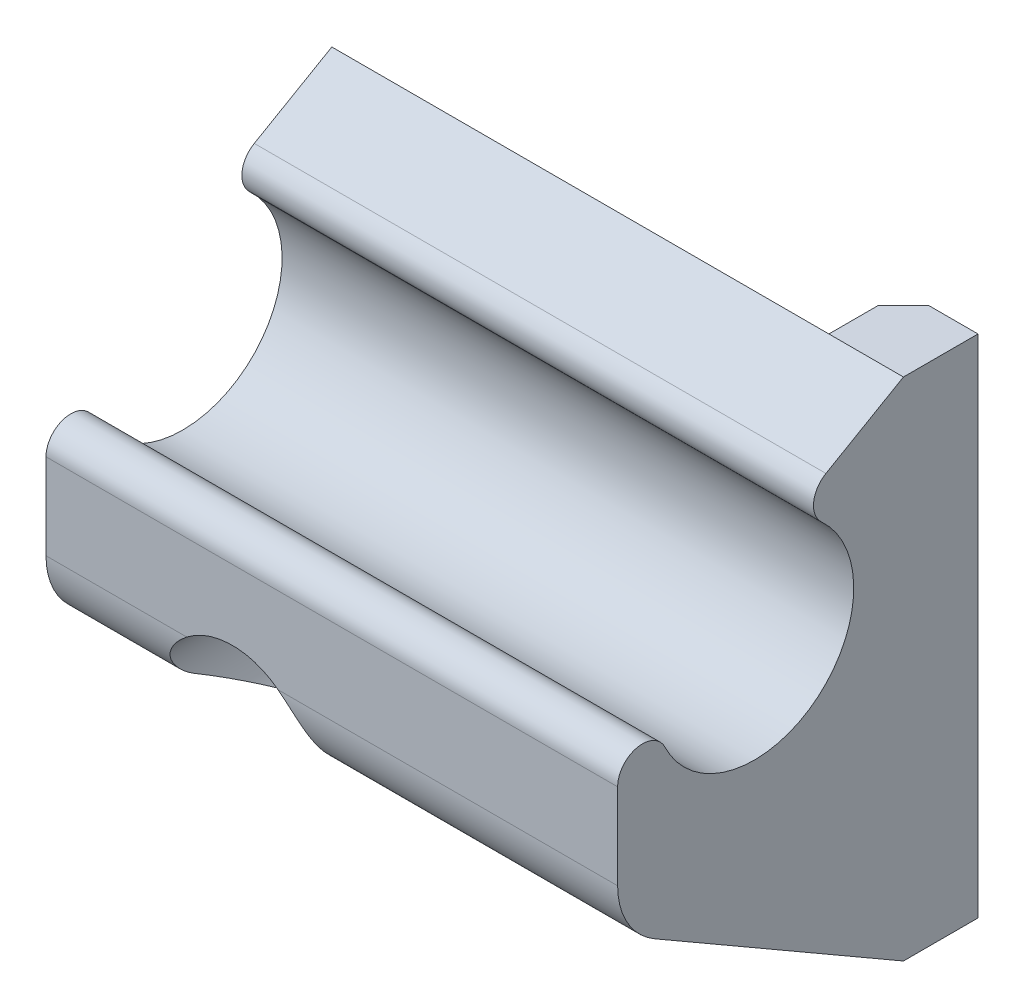
ISO-10303-21;
HEADER;
FILE_DESCRIPTION(('STEP AP214'),'2;1');
FILE_NAME('part.step','',(''),(''),'','','');
FILE_SCHEMA(('AUTOMOTIVE_DESIGN { 1 0 10303 214 1 1 1 1 }'));
ENDSEC;
DATA;
#1=APPLICATION_CONTEXT('core data for automotive mechanical design processes');
#2=APPLICATION_PROTOCOL_DEFINITION('international standard','automotive_design',2000,#1);
#3=PRODUCT_CONTEXT('',#1,'mechanical');
#4=PRODUCT('Part','Part','',(#3));
#5=PRODUCT_RELATED_PRODUCT_CATEGORY('part','',(#4));
#6=PRODUCT_DEFINITION_FORMATION('','',#4);
#7=PRODUCT_DEFINITION_CONTEXT('part definition',#1,'design');
#8=PRODUCT_DEFINITION('design','',#6,#7);
#9=PRODUCT_DEFINITION_SHAPE('','',#8);
#10=(LENGTH_UNIT() NAMED_UNIT(*) SI_UNIT(.MILLI.,.METRE.));
#11=(NAMED_UNIT(*) PLANE_ANGLE_UNIT() SI_UNIT($,.RADIAN.));
#12=(NAMED_UNIT(*) SI_UNIT($,.STERADIAN.) SOLID_ANGLE_UNIT());
#13=UNCERTAINTY_MEASURE_WITH_UNIT(LENGTH_MEASURE(1.E-05),#10,'distance_accuracy_value','');
#14=(GEOMETRIC_REPRESENTATION_CONTEXT(3) GLOBAL_UNCERTAINTY_ASSIGNED_CONTEXT((#13)) GLOBAL_UNIT_ASSIGNED_CONTEXT((#10,
#11,#12)) REPRESENTATION_CONTEXT('',''));
#15=CARTESIAN_POINT('',(0.,0.,0.));
#16=DIRECTION('',(0.,0.,1.));
#17=DIRECTION('',(1.,0.,0.));
#18=AXIS2_PLACEMENT_3D('',#15,#16,#17);
#19=CARTESIAN_POINT('',(0.,0.,0.));
#20=DIRECTION('',(0.,0.,1.));
#21=DIRECTION('',(1.,0.,0.));
#22=AXIS2_PLACEMENT_3D('',#19,#20,#21);
#23=CYLINDRICAL_SURFACE('',#22,1.6);
#24=CARTESIAN_POINT('',(0.,0.,0.));
#25=DIRECTION('',(0.,0.,1.));
#26=DIRECTION('',(1.,0.,0.));
#27=AXIS2_PLACEMENT_3D('',#24,#25,#26);
#28=CIRCLE('',#27,1.6);
#29=CARTESIAN_POINT('',(1.6,0.,0.));
#30=VERTEX_POINT('',#29);
#31=EDGE_CURVE('E193',#30,#30,#28,.T.);
#32=ORIENTED_EDGE('',*,*,#31,.F.);
#33=EDGE_LOOP('',(#32));
#34=FACE_BOUND('',#33,.T.);
#35=CARTESIAN_POINT('',(0.,0.,5.5));
#36=DIRECTION('',(0.,0.,1.));
#37=DIRECTION('',(1.,0.,0.));
#38=AXIS2_PLACEMENT_3D('',#35,#36,#37);
#39=CIRCLE('',#38,1.6);
#40=CARTESIAN_POINT('',(1.6,0.,5.5));
#41=VERTEX_POINT('',#40);
#42=EDGE_CURVE('E183',#41,#41,#39,.F.);
#43=ORIENTED_EDGE('',*,*,#42,.F.);
#44=EDGE_LOOP('',(#43));
#45=FACE_BOUND('',#44,.T.);
#46=ADVANCED_FACE('F35',(#34,#45),#23,.F.);
#47=CARTESIAN_POINT('',(-7.5,-6.,0.));
#48=DIRECTION('',(0.,-0.866025403784436,0.500000000000004));
#49=DIRECTION('',(0.,-0.500000000000004,-0.866025403784436));
#50=AXIS2_PLACEMENT_3D('',#47,#48,#49);
#51=PLANE('',#50);
#52=DIRECTION('',(0.,-0.500000000000004,-0.866025403784436));
#53=VECTOR('',#52,1.);
#54=CARTESIAN_POINT('',(15.5,-6.,0.));
#55=LINE('',#54,#53);
#56=CARTESIAN_POINT('',(15.5,-0.226497308103674,10.));
#57=VERTEX_POINT('',#56);
#58=CARTESIAN_POINT('',(15.5,-6.,0.));
#59=VERTEX_POINT('',#58);
#60=EDGE_CURVE('E209',#57,#59,#55,.T.);
#61=ORIENTED_EDGE('',*,*,#60,.F.);
#62=DIRECTION('',(1.,0.,0.));
#63=VECTOR('',#62,1.);
#64=CARTESIAN_POINT('',(-7.5,-0.226497308103675,10.));
#65=LINE('',#64,#63);
#66=CARTESIAN_POINT('',(2.99143760914745,-0.226497308103675,10.));
#67=VERTEX_POINT('',#66);
#68=EDGE_CURVE('E256',#57,#67,#65,.F.);
#69=ORIENTED_EDGE('',*,*,#68,.T.);
#70=CARTESIAN_POINT('',(0.,0.,10.3923048454132));
#71=DIRECTION('',(0.,-0.866025403784436,0.500000000000004));
#72=DIRECTION('',(0.,0.500000000000004,0.866025403784436));
#73=AXIS2_PLACEMENT_3D('',#70,#71,#72);
#74=ELLIPSE('',#73,5.99999999999995,3.);
#75=CARTESIAN_POINT('',(1.01083353386308,-2.82457351945702,5.5));
#76=VERTEX_POINT('',#75);
#77=EDGE_CURVE('E189',#76,#67,#74,.T.);
#78=ORIENTED_EDGE('',*,*,#77,.F.);
#79=DIRECTION('',(-1.,0.,0.));
#80=VECTOR('',#79,1.);
#81=CARTESIAN_POINT('',(-7.5,-2.82457351945702,5.5));
#82=LINE('',#81,#80);
#83=CARTESIAN_POINT('',(-1.01083353386308,-2.82457351945702,5.5));
#84=VERTEX_POINT('',#83);
#85=EDGE_CURVE('E186',#76,#84,#82,.T.);
#86=ORIENTED_EDGE('',*,*,#85,.T.);
#87=CARTESIAN_POINT('',(-2.99143760914745,-0.226497308103675,10.));
#88=VERTEX_POINT('',#87);
#89=EDGE_CURVE('E192',#88,#84,#74,.T.);
#90=ORIENTED_EDGE('',*,*,#89,.F.);
#91=DIRECTION('',(1.,0.,0.));
#92=VECTOR('',#91,1.);
#93=CARTESIAN_POINT('',(-7.5,-0.226497308103675,10.));
#94=LINE('',#93,#92);
#95=CARTESIAN_POINT('',(-7.5,-0.226497308103674,10.));
#96=VERTEX_POINT('',#95);
#97=EDGE_CURVE('E254',#88,#96,#94,.F.);
#98=ORIENTED_EDGE('',*,*,#97,.T.);
#99=DIRECTION('',(0.,-0.500000000000004,-0.866025403784436));
#100=VECTOR('',#99,1.);
#101=CARTESIAN_POINT('',(-7.5,-6.,0.));
#102=LINE('',#101,#100);
#103=CARTESIAN_POINT('',(-7.5,-6.,0.));
#104=VERTEX_POINT('',#103);
#105=EDGE_CURVE('E228',#96,#104,#102,.T.);
#106=ORIENTED_EDGE('',*,*,#105,.T.);
#107=DIRECTION('',(1.,0.,0.));
#108=VECTOR('',#107,1.);
#109=CARTESIAN_POINT('',(-7.5,-6.,0.));
#110=LINE('',#109,#108);
#111=CARTESIAN_POINT('',(12.5,-6.,0.));
#112=VERTEX_POINT('',#111);
#113=EDGE_CURVE('E231',#104,#112,#110,.T.);
#114=ORIENTED_EDGE('',*,*,#113,.T.);
#115=DIRECTION('',(-1.,0.,0.));
#116=VECTOR('',#115,1.);
#117=CARTESIAN_POINT('',(12.5,-6.,0.));
#118=LINE('',#117,#116);
#119=EDGE_CURVE('E148',#59,#112,#118,.T.);
#120=ORIENTED_EDGE('',*,*,#119,.F.);
#121=EDGE_LOOP('',(#61,#69,#78,#86,#90,#98,#106,#114,#120));
#122=FACE_BOUND('',#121,.T.);
#123=ADVANCED_FACE('F284',(#122),#51,.T.);
#124=CARTESIAN_POINT('',(-7.5,0.639528095680765,11.5));
#125=DIRECTION('',(0.,0.,1.));
#126=DIRECTION('',(0.,-1.,0.));
#127=AXIS2_PLACEMENT_3D('',#124,#125,#126);
#128=PLANE('',#127);
#129=CARTESIAN_POINT('',(0.,0.,11.5));
#130=DIRECTION('',(0.,0.,1.));
#131=DIRECTION('',(1.,0.,0.));
#132=AXIS2_PLACEMENT_3D('',#129,#130,#131);
#133=CIRCLE('',#132,3.);
#134=CARTESIAN_POINT('',(1.83728427459152,2.37157890324964,11.5));
#135=VERTEX_POINT('',#134);
#136=CARTESIAN_POINT('',(-1.83728427459152,2.37157890324964,11.5));
#137=VERTEX_POINT('',#136);
#138=EDGE_CURVE('E179',#135,#137,#133,.T.);
#139=ORIENTED_EDGE('',*,*,#138,.F.);
#140=DIRECTION('',(1.,0.,0.));
#141=VECTOR('',#140,1.);
#142=CARTESIAN_POINT('',(-7.5,2.37157890324964,11.5));
#143=LINE('',#142,#141);
#144=CARTESIAN_POINT('',(15.5,2.37157890324963,11.5));
#145=VERTEX_POINT('',#144);
#146=EDGE_CURVE('E249',#135,#145,#143,.T.);
#147=ORIENTED_EDGE('',*,*,#146,.T.);
#148=DIRECTION('',(0.,-1.,0.));
#149=VECTOR('',#148,1.);
#150=CARTESIAN_POINT('',(15.5,0.639528095680765,11.5));
#151=LINE('',#150,#149);
#152=CARTESIAN_POINT('',(15.5,5.82055052822966,11.5));
#153=VERTEX_POINT('',#152);
#154=EDGE_CURVE('E207',#153,#145,#151,.T.);
#155=ORIENTED_EDGE('',*,*,#154,.F.);
#156=DIRECTION('',(1.,0.,0.));
#157=VECTOR('',#156,1.);
#158=CARTESIAN_POINT('',(-7.5,5.82055052822966,11.5));
#159=LINE('',#158,#157);
#160=CARTESIAN_POINT('',(-7.5,5.82055052822966,11.5));
#161=VERTEX_POINT('',#160);
#162=EDGE_CURVE('E235',#161,#153,#159,.T.);
#163=ORIENTED_EDGE('',*,*,#162,.F.);
#164=DIRECTION('',(0.,-1.,0.));
#165=VECTOR('',#164,1.);
#166=CARTESIAN_POINT('',(-7.5,0.639528095680765,11.5));
#167=LINE('',#166,#165);
#168=CARTESIAN_POINT('',(-7.5,2.37157890324963,11.5));
#169=VERTEX_POINT('',#168);
#170=EDGE_CURVE('E225',#161,#169,#167,.T.);
#171=ORIENTED_EDGE('',*,*,#170,.T.);
#172=DIRECTION('',(1.,0.,0.));
#173=VECTOR('',#172,1.);
#174=CARTESIAN_POINT('',(-7.5,2.37157890324964,11.5));
#175=LINE('',#174,#173);
#176=EDGE_CURVE('E234',#169,#137,#175,.T.);
#177=ORIENTED_EDGE('',*,*,#176,.T.);
#178=EDGE_LOOP('',(#139,#147,#155,#163,#171,#177));
#179=FACE_BOUND('',#178,.T.);
#180=ADVANCED_FACE('F295',(#179),#128,.T.);
#181=CARTESIAN_POINT('',(-7.5,5.82055052822966,10.5));
#182=DIRECTION('',(1.,0.,0.));
#183=DIRECTION('',(0.,0.,-1.));
#184=AXIS2_PLACEMENT_3D('',#181,#182,#183);
#185=CYLINDRICAL_SURFACE('',#184,1.);
#186=ORIENTED_EDGE('',*,*,#162,.T.);
#187=CARTESIAN_POINT('',(15.5,5.82055052822966,10.5));
#188=DIRECTION('',(1.,0.,0.));
#189=DIRECTION('',(0.,0.,-1.));
#190=AXIS2_PLACEMENT_3D('',#187,#188,#189);
#191=CIRCLE('',#190,1.);
#192=CARTESIAN_POINT('',(15.5,6.25644042258373,9.6));
#193=VERTEX_POINT('',#192);
#194=EDGE_CURVE('E204',#193,#153,#191,.T.);
#195=ORIENTED_EDGE('',*,*,#194,.F.);
#196=DIRECTION('',(1.,0.,0.));
#197=VECTOR('',#196,1.);
#198=CARTESIAN_POINT('',(-7.5,6.25644042258373,9.6));
#199=LINE('',#198,#197);
#200=CARTESIAN_POINT('',(-7.5,6.25644042258373,9.6));
#201=VERTEX_POINT('',#200);
#202=EDGE_CURVE('E237',#201,#193,#199,.T.);
#203=ORIENTED_EDGE('',*,*,#202,.F.);
#204=CARTESIAN_POINT('',(-7.5,5.82055052822966,10.5));
#205=DIRECTION('',(1.,0.,0.));
#206=DIRECTION('',(0.,0.,-1.));
#207=AXIS2_PLACEMENT_3D('',#204,#205,#206);
#208=CIRCLE('',#207,1.);
#209=EDGE_CURVE('E222',#201,#161,#208,.T.);
#210=ORIENTED_EDGE('',*,*,#209,.T.);
#211=EDGE_LOOP('',(#186,#195,#203,#210));
#212=FACE_BOUND('',#211,.T.);
#213=ADVANCED_FACE('F299',(#212),#185,.T.);
#214=CARTESIAN_POINT('',(-7.5,8.,6.));
#215=DIRECTION('',(1.,0.,0.));
#216=DIRECTION('',(0.,0.,-1.));
#217=AXIS2_PLACEMENT_3D('',#214,#215,#216);
#218=CYLINDRICAL_SURFACE('',#217,4.);
#219=ORIENTED_EDGE('',*,*,#202,.T.);
#220=CARTESIAN_POINT('',(15.5,8.,6.));
#221=DIRECTION('',(-1.,0.,0.));
#222=DIRECTION('',(0.,0.,-1.));
#223=AXIS2_PLACEMENT_3D('',#220,#221,#222);
#224=CIRCLE('',#223,4.);
#225=CARTESIAN_POINT('',(15.5,10.9471088873752,3.29545767162835));
#226=VERTEX_POINT('',#225);
#227=EDGE_CURVE('E201',#226,#193,#224,.T.);
#228=ORIENTED_EDGE('',*,*,#227,.F.);
#229=DIRECTION('',(1.,0.,0.));
#230=VECTOR('',#229,1.);
#231=CARTESIAN_POINT('',(-7.5,10.9471088873752,3.29545767162835));
#232=LINE('',#231,#230);
#233=CARTESIAN_POINT('',(-7.5,10.9471088873752,3.29545767162835));
#234=VERTEX_POINT('',#233);
#235=EDGE_CURVE('E239',#234,#226,#232,.T.);
#236=ORIENTED_EDGE('',*,*,#235,.F.);
#237=CARTESIAN_POINT('',(-7.5,8.,6.));
#238=DIRECTION('',(-1.,0.,0.));
#239=DIRECTION('',(0.,0.,-1.));
#240=AXIS2_PLACEMENT_3D('',#237,#238,#239);
#241=CIRCLE('',#240,4.);
#242=EDGE_CURVE('E219',#234,#201,#241,.T.);
#243=ORIENTED_EDGE('',*,*,#242,.T.);
#244=EDGE_LOOP('',(#219,#228,#236,#243));
#245=FACE_BOUND('',#244,.T.);
#246=ADVANCED_FACE('F303',(#245),#218,.F.);
#247=CARTESIAN_POINT('',(-7.5,11.683886109219,2.61932208953544));
#248=DIRECTION('',(1.,0.,0.));
#249=DIRECTION('',(0.,0.,-1.));
#250=AXIS2_PLACEMENT_3D('',#247,#248,#249);
#251=CYLINDRICAL_SURFACE('',#250,0.999999999999999);
#252=ORIENTED_EDGE('',*,*,#235,.T.);
#253=CARTESIAN_POINT('',(15.5,11.683886109219,2.61932208953544));
#254=DIRECTION('',(1.,0.,0.));
#255=DIRECTION('',(0.,0.,-1.));
#256=AXIS2_PLACEMENT_3D('',#253,#254,#255);
#257=CIRCLE('',#256,0.999999999999999);
#258=CARTESIAN_POINT('',(15.5,12.5499115130035,3.11932208953545));
#259=VERTEX_POINT('',#258);
#260=EDGE_CURVE('E198',#259,#226,#257,.T.);
#261=ORIENTED_EDGE('',*,*,#260,.F.);
#262=DIRECTION('',(1.,0.,0.));
#263=VECTOR('',#262,1.);
#264=CARTESIAN_POINT('',(-7.5,12.5499115130035,3.11932208953545));
#265=LINE('',#264,#263);
#266=CARTESIAN_POINT('',(-7.5,12.5499115130035,3.11932208953545));
#267=VERTEX_POINT('',#266);
#268=EDGE_CURVE('E241',#267,#259,#265,.T.);
#269=ORIENTED_EDGE('',*,*,#268,.F.);
#270=CARTESIAN_POINT('',(-7.5,11.683886109219,2.61932208953544));
#271=DIRECTION('',(1.,0.,0.));
#272=DIRECTION('',(0.,0.,-1.));
#273=AXIS2_PLACEMENT_3D('',#270,#271,#272);
#274=CIRCLE('',#273,0.999999999999999);
#275=EDGE_CURVE('E216',#267,#234,#274,.T.);
#276=ORIENTED_EDGE('',*,*,#275,.T.);
#277=EDGE_LOOP('',(#252,#261,#269,#276));
#278=FACE_BOUND('',#277,.T.);
#279=ADVANCED_FACE('F307',(#278),#251,.T.);
#280=CARTESIAN_POINT('',(-7.5,14.3508529610859,0.));
#281=DIRECTION('',(0.,0.866025403784436,0.500000000000004));
#282=DIRECTION('',(0.,-0.500000000000004,0.866025403784436));
#283=AXIS2_PLACEMENT_3D('',#280,#281,#282);
#284=PLANE('',#283);
#285=ORIENTED_EDGE('',*,*,#268,.T.);
#286=DIRECTION('',(0.,-0.500000000000004,0.866025403784436));
#287=VECTOR('',#286,1.);
#288=CARTESIAN_POINT('',(15.5,14.3508529610859,0.));
#289=LINE('',#288,#287);
#290=CARTESIAN_POINT('',(15.5,14.3508529610859,0.));
#291=VERTEX_POINT('',#290);
#292=EDGE_CURVE('E196',#291,#259,#289,.T.);
#293=ORIENTED_EDGE('',*,*,#292,.F.);
#294=DIRECTION('',(1.,0.,0.));
#295=VECTOR('',#294,1.);
#296=CARTESIAN_POINT('',(12.5,14.3508529610859,0.));
#297=LINE('',#296,#295);
#298=CARTESIAN_POINT('',(12.5,14.3508529610859,0.));
#299=VERTEX_POINT('',#298);
#300=EDGE_CURVE('E155',#299,#291,#297,.T.);
#301=ORIENTED_EDGE('',*,*,#300,.F.);
#302=DIRECTION('',(1.,0.,0.));
#303=VECTOR('',#302,1.);
#304=CARTESIAN_POINT('',(-7.5,14.3508529610859,0.));
#305=LINE('',#304,#303);
#306=CARTESIAN_POINT('',(-7.5,14.3508529610859,0.));
#307=VERTEX_POINT('',#306);
#308=EDGE_CURVE('E230',#307,#299,#305,.T.);
#309=ORIENTED_EDGE('',*,*,#308,.F.);
#310=DIRECTION('',(0.,-0.500000000000004,0.866025403784436));
#311=VECTOR('',#310,1.);
#312=CARTESIAN_POINT('',(-7.5,14.3508529610859,0.));
#313=LINE('',#312,#311);
#314=EDGE_CURVE('E213',#307,#267,#313,.T.);
#315=ORIENTED_EDGE('',*,*,#314,.T.);
#316=EDGE_LOOP('',(#285,#293,#301,#309,#315));
#317=FACE_BOUND('',#316,.T.);
#318=ADVANCED_FACE('F311',(#317),#284,.T.);
#319=CARTESIAN_POINT('',(-7.5,0.,0.));
#320=DIRECTION('',(0.,0.,-1.));
#321=DIRECTION('',(-1.,0.,0.));
#322=AXIS2_PLACEMENT_3D('',#319,#320,#321);
#323=PLANE('',#322);
#324=DIRECTION('',(0.,1.,0.));
#325=VECTOR('',#324,1.);
#326=CARTESIAN_POINT('',(12.5,14.3508529610859,0.));
#327=LINE('',#326,#325);
#328=EDGE_CURVE('E170',#112,#299,#327,.T.);
#329=ORIENTED_EDGE('',*,*,#328,.F.);
#330=ORIENTED_EDGE('',*,*,#113,.F.);
#331=DIRECTION('',(0.,1.,0.));
#332=VECTOR('',#331,1.);
#333=CARTESIAN_POINT('',(-7.5,0.,0.));
#334=LINE('',#333,#332);
#335=EDGE_CURVE('E211',#104,#307,#334,.T.);
#336=ORIENTED_EDGE('',*,*,#335,.T.);
#337=ORIENTED_EDGE('',*,*,#308,.T.);
#338=EDGE_LOOP('',(#329,#330,#336,#337));
#339=FACE_BOUND('',#338,.T.);
#340=ORIENTED_EDGE('',*,*,#31,.T.);
#341=EDGE_LOOP('',(#340));
#342=FACE_BOUND('',#341,.T.);
#343=ADVANCED_FACE('F291',(#339,#342),#323,.T.);
#344=CARTESIAN_POINT('',(-7.5,5.82055052822966,10.5));
#345=DIRECTION('',(1.,0.,0.));
#346=DIRECTION('',(0.,0.,-1.));
#347=AXIS2_PLACEMENT_3D('',#344,#345,#346);
#348=PLANE('',#347);
#349=ORIENTED_EDGE('',*,*,#105,.F.);
#350=CARTESIAN_POINT('',(-7.5,2.37157890324963,8.5));
#351=DIRECTION('',(1.,0.,0.));
#352=DIRECTION('',(0.,0.,-1.));
#353=AXIS2_PLACEMENT_3D('',#350,#351,#352);
#354=CIRCLE('',#353,3.);
#355=EDGE_CURVE('E333',#96,#169,#354,.F.);
#356=ORIENTED_EDGE('',*,*,#355,.T.);
#357=ORIENTED_EDGE('',*,*,#170,.F.);
#358=ORIENTED_EDGE('',*,*,#209,.F.);
#359=ORIENTED_EDGE('',*,*,#242,.F.);
#360=ORIENTED_EDGE('',*,*,#275,.F.);
#361=ORIENTED_EDGE('',*,*,#314,.F.);
#362=ORIENTED_EDGE('',*,*,#335,.F.);
#363=EDGE_LOOP('',(#349,#356,#357,#358,#359,#360,#361,#362));
#364=FACE_BOUND('',#363,.T.);
#365=ADVANCED_FACE('F288',(#364),#348,.F.);
#366=CARTESIAN_POINT('',(15.5,5.82055052822966,10.5));
#367=DIRECTION('',(1.,0.,0.));
#368=DIRECTION('',(0.,0.,-1.));
#369=AXIS2_PLACEMENT_3D('',#366,#367,#368);
#370=PLANE('',#369);
#371=ORIENTED_EDGE('',*,*,#154,.T.);
#372=CARTESIAN_POINT('',(15.5,2.37157890324963,8.5));
#373=DIRECTION('',(1.,0.,0.));
#374=DIRECTION('',(0.,0.,-1.));
#375=AXIS2_PLACEMENT_3D('',#372,#373,#374);
#376=CIRCLE('',#375,3.);
#377=EDGE_CURVE('E252',#145,#57,#376,.T.);
#378=ORIENTED_EDGE('',*,*,#377,.T.);
#379=ORIENTED_EDGE('',*,*,#60,.T.);
#380=DIRECTION('',(0.,0.,1.));
#381=VECTOR('',#380,1.);
#382=CARTESIAN_POINT('',(15.5,-6.,-3.));
#383=LINE('',#382,#381);
#384=CARTESIAN_POINT('',(15.5,-6.,-3.));
#385=VERTEX_POINT('',#384);
#386=EDGE_CURVE('E159',#385,#59,#383,.T.);
#387=ORIENTED_EDGE('',*,*,#386,.F.);
#388=DIRECTION('',(0.,-1.,0.));
#389=VECTOR('',#388,1.);
#390=CARTESIAN_POINT('',(15.5,14.3508529610859,-3.));
#391=LINE('',#390,#389);
#392=CARTESIAN_POINT('',(15.5,14.3508529610859,-3.));
#393=VERTEX_POINT('',#392);
#394=EDGE_CURVE('E144',#393,#385,#391,.T.);
#395=ORIENTED_EDGE('',*,*,#394,.F.);
#396=DIRECTION('',(0.,0.,1.));
#397=VECTOR('',#396,1.);
#398=CARTESIAN_POINT('',(15.5,14.3508529610859,-3.));
#399=LINE('',#398,#397);
#400=EDGE_CURVE('E152',#393,#291,#399,.T.);
#401=ORIENTED_EDGE('',*,*,#400,.T.);
#402=ORIENTED_EDGE('',*,*,#292,.T.);
#403=ORIENTED_EDGE('',*,*,#260,.T.);
#404=ORIENTED_EDGE('',*,*,#227,.T.);
#405=ORIENTED_EDGE('',*,*,#194,.T.);
#406=EDGE_LOOP('',(#371,#378,#379,#387,#395,#401,#402,#403,#404,#405));
#407=FACE_BOUND('',#406,.T.);
#408=ADVANCED_FACE('F162',(#407),#370,.T.);
#409=CARTESIAN_POINT('',(0.,0.,5.5));
#410=DIRECTION('',(0.,0.,1.));
#411=DIRECTION('',(1.,0.,0.));
#412=AXIS2_PLACEMENT_3D('',#409,#410,#411);
#413=PLANE('',#412);
#414=CARTESIAN_POINT('',(0.,0.,5.5));
#415=DIRECTION('',(0.,0.,1.));
#416=DIRECTION('',(1.,0.,0.));
#417=AXIS2_PLACEMENT_3D('',#414,#415,#416);
#418=CIRCLE('',#417,3.);
#419=EDGE_CURVE('E180',#76,#84,#418,.T.);
#420=ORIENTED_EDGE('',*,*,#419,.T.);
#421=ORIENTED_EDGE('',*,*,#85,.F.);
#422=EDGE_LOOP('',(#420,#421));
#423=FACE_BOUND('',#422,.T.);
#424=ORIENTED_EDGE('',*,*,#42,.T.);
#425=EDGE_LOOP('',(#424));
#426=FACE_BOUND('',#425,.T.);
#427=ADVANCED_FACE('F278',(#423,#426),#413,.T.);
#428=CARTESIAN_POINT('',(0.,0.,5.5));
#429=DIRECTION('',(0.,0.,1.));
#430=DIRECTION('',(1.,0.,0.));
#431=AXIS2_PLACEMENT_3D('',#428,#429,#430);
#432=CYLINDRICAL_SURFACE('',#431,3.);
#433=ORIENTED_EDGE('',*,*,#77,.T.);
#434=CARTESIAN_POINT('',(2.99143760914745,-0.226497308103676,10.));
#435=CARTESIAN_POINT('',(2.99422923616977,-0.189567189196158,10.0639786175245));
#436=CARTESIAN_POINT('',(2.99652301154581,-0.150246891297272,10.1266128569779));
#437=CARTESIAN_POINT('',(2.99954088164408,-0.0670497068759163,10.2488711213678));
#438=CARTESIAN_POINT('',(3.0002640252498,-0.0231700762313076,10.3084933009817));
#439=CARTESIAN_POINT('',(2.99955986337934,0.0691411892420773,10.4246605089501));
#440=CARTESIAN_POINT('',(2.99812017517404,0.117597535583781,10.4811858833411));
#441=CARTESIAN_POINT('',(2.99245910324519,0.21849755569298,10.5903983568328));
#442=CARTESIAN_POINT('',(2.9882382473366,0.270940471211989,10.6430861821239));
#443=CARTESIAN_POINT('',(2.9763822949261,0.379676048864135,10.7445220456627));
#444=CARTESIAN_POINT('',(2.96872942979379,0.435987437743417,10.7932480008701));
#445=CARTESIAN_POINT('',(2.94942634895196,0.551652264177338,10.8860771392092));
#446=CARTESIAN_POINT('',(2.93777664076882,0.611005314682699,10.9301809083468));
#447=CARTESIAN_POINT('',(2.91001566089294,0.731874146758372,11.0133104935569));
#448=CARTESIAN_POINT('',(2.89391966042945,0.793381907432634,11.0523530303585));
#449=CARTESIAN_POINT('',(2.85684807087343,0.91795397486434,11.1252966121419));
#450=CARTESIAN_POINT('',(2.83587313427711,0.981018072474082,11.1591983436411));
#451=CARTESIAN_POINT('',(2.79106057374119,1.10168680927889,11.2187228635581));
#452=CARTESIAN_POINT('',(2.76769616245734,1.15922942288927,11.2448292781957));
#453=CARTESIAN_POINT('',(2.71667797213912,1.27421265621233,11.2927887349323));
#454=CARTESIAN_POINT('',(2.68902277533709,1.33165323584268,11.3146403657583));
#455=CARTESIAN_POINT('',(2.62941858625115,1.44578829950255,11.3542183856138));
#456=CARTESIAN_POINT('',(2.59746608413031,1.50248213162307,11.3719413698864));
#457=CARTESIAN_POINT('',(2.52939710599776,1.61445127105591,11.4034715325361));
#458=CARTESIAN_POINT('',(2.49327906662891,1.6697260362041,11.4172772339574));
#459=CARTESIAN_POINT('',(2.38249732101313,1.82746847004316,11.452142482643));
#460=CARTESIAN_POINT('',(2.30254590927922,1.92734564947988,11.4684499333043));
#461=CARTESIAN_POINT('',(2.13002842676146,2.11645018140153,11.4906517412486));
#462=CARTESIAN_POINT('',(2.03747924193485,2.20569149479593,11.4965598924496));
#463=CARTESIAN_POINT('',(1.90612468233449,2.31703201825292,11.4996383037789));
#464=CARTESIAN_POINT('',(1.87199392027949,2.34469641870988,11.499999619069));
#465=CARTESIAN_POINT('',(1.83728427459152,2.37157890324964,11.5));
#466=B_SPLINE_CURVE_WITH_KNOTS('',3,(#434,#435,#436,#437,#438,#439,#440,#441,#442,#443,#444,
#445,#446,#447,#448,#449,#450,#451,#452,#453,#454,#455,#456,#457,#458,#459,#460,#461,#462,#463,
#464,#465),.UNSPECIFIED.,.F.,.F.,(4,2,2,2,2,2,2,2,2,2,2,2,2,2,2,4),(0.,0.221740863446923,
0.443615967565262,0.666766209927441,0.889874114632206,1.11415070119715,1.3383988192492,
1.56188611146115,1.78534353223136,1.98718433879194,2.18909198048116,2.39116554382969,
2.5933151952123,2.97851980456821,3.36321308175857,3.49496160368047),.UNSPECIFIED.);
#467=EDGE_CURVE('E264',#67,#135,#466,.T.);
#468=ORIENTED_EDGE('',*,*,#467,.T.);
#469=ORIENTED_EDGE('',*,*,#138,.T.);
#470=CARTESIAN_POINT('',(-1.83728427459152,2.37157890324964,11.5));
#471=CARTESIAN_POINT('',(-1.89219043618027,2.3290541911072,11.4999998346668));
#472=CARTESIAN_POINT('',(-1.94562109069457,2.28459919078027,11.4990957357539));
#473=CARTESIAN_POINT('',(-2.04925716872512,2.19211251262724,11.4949852190443));
#474=CARTESIAN_POINT('',(-2.0994604484118,2.14407850220248,11.4917772877648));
#475=CARTESIAN_POINT('',(-2.19645696719701,2.04460788266249,11.4825479011047));
#476=CARTESIAN_POINT('',(-2.24323820152374,1.99316039932583,11.4765170432073));
#477=CARTESIAN_POINT('',(-2.33288888660752,1.88744018230503,11.4611588519524));
#478=CARTESIAN_POINT('',(-2.37575920951104,1.83316808278042,11.4518322558278));
#479=CARTESIAN_POINT('',(-2.45752177181632,1.72202460702019,11.4293869157853));
#480=CARTESIAN_POINT('',(-2.49639349149017,1.66514179843485,11.4162498161241));
#481=CARTESIAN_POINT('',(-2.56969987794159,1.54962070805179,11.3858194533779));
#482=CARTESIAN_POINT('',(-2.60413299203642,1.49098182074649,11.3685247419339));
#483=CARTESIAN_POINT('',(-2.66829816964429,1.37283900204244,11.3295532291737));
#484=CARTESIAN_POINT('',(-2.69804416958919,1.3133382323606,11.3078898727363));
#485=CARTESIAN_POINT('',(-2.75292304938768,1.19404215064144,11.2599911713636));
#486=CARTESIAN_POINT('',(-2.77805436920719,1.13424674598907,11.2337542861275));
#487=CARTESIAN_POINT('',(-2.84317800785876,0.964475397909271,11.1523432989337));
#488=CARTESIAN_POINT('',(-2.87766847502356,0.85500444469621,11.0915154083426));
#489=CARTESIAN_POINT('',(-2.93253667218059,0.64216498815175,10.9546276344451));
#490=CARTESIAN_POINT('',(-2.95289554870056,0.538804804859412,10.8785475762928));
#491=CARTESIAN_POINT('',(-2.98237991473662,0.340119842402259,10.7114096772572));
#492=CARTESIAN_POINT('',(-2.99130170086561,0.244968199849285,10.620112113702));
#493=CARTESIAN_POINT('',(-3.00056137293529,0.0674047923555127,10.425644420897));
#494=CARTESIAN_POINT('',(-3.00090616553143,-0.0150171700472807,10.3224839115881));
#495=CARTESIAN_POINT('',(-2.99791343138883,-0.114466605833432,10.1796980935986));
#496=CARTESIAN_POINT('',(-2.99691258044757,-0.137964253731051,10.1443829516342));
#497=CARTESIAN_POINT('',(-2.99447522900718,-0.183395556056177,10.072861418066));
#498=CARTESIAN_POINT('',(-2.99303949091065,-0.205331865220967,10.0366566872566));
#499=CARTESIAN_POINT('',(-2.99143760914745,-0.226497308103676,10.));
#500=B_SPLINE_CURVE_WITH_KNOTS('',3,(#470,#471,#472,#473,#474,#475,#476,#477,#478,#479,#480,
#481,#482,#483,#484,#485,#486,#487,#488,#489,#490,#491,#492,#493,#494,#495,#496,#497,#498,#499),
.UNSPECIFIED.,.F.,.F.,(4,2,2,2,2,2,2,2,2,2,2,2,2,2,4),(0.,0.208319969521022,0.416776918384907,
0.625933184470166,0.835042693396889,1.04517673442845,1.25538408478239,1.46495411495027,
1.67459486223873,2.06225195218984,2.45042524071017,2.84542028975325,3.24009725728063,
3.36736015196778,3.49440122024487),.UNSPECIFIED.);
#501=EDGE_CURVE('E258',#137,#88,#500,.T.);
#502=ORIENTED_EDGE('',*,*,#501,.T.);
#503=ORIENTED_EDGE('',*,*,#89,.T.);
#504=ORIENTED_EDGE('',*,*,#419,.F.);
#505=EDGE_LOOP('',(#433,#468,#469,#502,#503,#504));
#506=FACE_BOUND('',#505,.T.);
#507=ADVANCED_FACE('F272',(#506),#432,.F.);
#508=CARTESIAN_POINT('',(12.5,14.3508529610859,-3.));
#509=DIRECTION('',(1.,0.,0.));
#510=DIRECTION('',(0.,1.,0.));
#511=AXIS2_PLACEMENT_3D('',#508,#509,#510);
#512=PLANE('',#511);
#513=DIRECTION('',(0.,0.,1.));
#514=VECTOR('',#513,1.);
#515=CARTESIAN_POINT('',(12.5,14.3508529610859,-3.));
#516=LINE('',#515,#514);
#517=CARTESIAN_POINT('',(12.5,14.3508529610859,-1.99999999999999));
#518=VERTEX_POINT('',#517);
#519=EDGE_CURVE('E158',#518,#299,#516,.T.);
#520=ORIENTED_EDGE('',*,*,#519,.F.);
#521=DIRECTION('',(0.,-1.,0.));
#522=VECTOR('',#521,1.);
#523=CARTESIAN_POINT('',(12.5,14.3508529610859,-1.99999999999999));
#524=LINE('',#523,#522);
#525=CARTESIAN_POINT('',(12.5,-6.,-1.99999999999999));
#526=VERTEX_POINT('',#525);
#527=EDGE_CURVE('E43',#518,#526,#524,.T.);
#528=ORIENTED_EDGE('',*,*,#527,.T.);
#529=DIRECTION('',(0.,0.,1.));
#530=VECTOR('',#529,1.);
#531=CARTESIAN_POINT('',(12.5,-6.,-3.));
#532=LINE('',#531,#530);
#533=EDGE_CURVE('E167',#526,#112,#532,.T.);
#534=ORIENTED_EDGE('',*,*,#533,.T.);
#535=ORIENTED_EDGE('',*,*,#328,.T.);
#536=EDGE_LOOP('',(#520,#528,#534,#535));
#537=FACE_BOUND('',#536,.T.);
#538=ADVANCED_FACE('F277',(#537),#512,.F.);
#539=CARTESIAN_POINT('',(12.5,14.3508529610859,-3.));
#540=DIRECTION('',(0.,-1.,0.));
#541=DIRECTION('',(1.,0.,0.));
#542=AXIS2_PLACEMENT_3D('',#539,#540,#541);
#543=PLANE('',#542);
#544=DIRECTION('',(1.,0.,0.));
#545=VECTOR('',#544,1.);
#546=CARTESIAN_POINT('',(12.5,14.3508529610859,-3.));
#547=LINE('',#546,#545);
#548=CARTESIAN_POINT('',(13.5,14.3508529610859,-3.));
#549=VERTEX_POINT('',#548);
#550=EDGE_CURVE('E139',#549,#393,#547,.T.);
#551=ORIENTED_EDGE('',*,*,#550,.F.);
#552=DIRECTION('',(0.707106781186546,0.,-0.70710678118655));
#553=VECTOR('',#552,1.);
#554=CARTESIAN_POINT('',(13.5,14.3508529610859,-3.00000000000001));
#555=LINE('',#554,#553);
#556=EDGE_CURVE('E57',#549,#518,#555,.F.);
#557=ORIENTED_EDGE('',*,*,#556,.T.);
#558=ORIENTED_EDGE('',*,*,#519,.T.);
#559=ORIENTED_EDGE('',*,*,#300,.T.);
#560=ORIENTED_EDGE('',*,*,#400,.F.);
#561=EDGE_LOOP('',(#551,#557,#558,#559,#560));
#562=FACE_BOUND('',#561,.T.);
#563=ADVANCED_FACE('F153',(#562),#543,.F.);
#564=CARTESIAN_POINT('',(12.5,-6.,-3.));
#565=DIRECTION('',(0.,1.,0.));
#566=DIRECTION('',(0.,0.,1.));
#567=AXIS2_PLACEMENT_3D('',#564,#565,#566);
#568=PLANE('',#567);
#569=ORIENTED_EDGE('',*,*,#533,.F.);
#570=DIRECTION('',(-0.707106781186546,0.,0.70710678118655));
#571=VECTOR('',#570,1.);
#572=CARTESIAN_POINT('',(13.5,-6.,-3.));
#573=LINE('',#572,#571);
#574=CARTESIAN_POINT('',(13.5,-6.,-3.));
#575=VERTEX_POINT('',#574);
#576=EDGE_CURVE('E11',#526,#575,#573,.F.);
#577=ORIENTED_EDGE('',*,*,#576,.T.);
#578=DIRECTION('',(-1.,0.,0.));
#579=VECTOR('',#578,1.);
#580=CARTESIAN_POINT('',(12.5,-6.,-3.));
#581=LINE('',#580,#579);
#582=EDGE_CURVE('E165',#385,#575,#581,.T.);
#583=ORIENTED_EDGE('',*,*,#582,.F.);
#584=ORIENTED_EDGE('',*,*,#386,.T.);
#585=ORIENTED_EDGE('',*,*,#119,.T.);
#586=EDGE_LOOP('',(#569,#577,#583,#584,#585));
#587=FACE_BOUND('',#586,.T.);
#588=ADVANCED_FACE('F327',(#587),#568,.F.);
#589=CARTESIAN_POINT('',(0.,0.,-3.));
#590=DIRECTION('',(0.,0.,1.));
#591=DIRECTION('',(1.,0.,0.));
#592=AXIS2_PLACEMENT_3D('',#589,#590,#591);
#593=PLANE('',#592);
#594=ORIENTED_EDGE('',*,*,#582,.T.);
#595=DIRECTION('',(0.,1.,0.));
#596=VECTOR('',#595,1.);
#597=CARTESIAN_POINT('',(13.5,0.,-3.));
#598=LINE('',#597,#596);
#599=EDGE_CURVE('E147',#575,#549,#598,.T.);
#600=ORIENTED_EDGE('',*,*,#599,.T.);
#601=ORIENTED_EDGE('',*,*,#550,.T.);
#602=ORIENTED_EDGE('',*,*,#394,.T.);
#603=EDGE_LOOP('',(#594,#600,#601,#602));
#604=FACE_BOUND('',#603,.T.);
#605=ADVANCED_FACE('F142',(#604),#593,.F.);
#606=CARTESIAN_POINT('',(-7.5,2.37157890324963,8.5));
#607=DIRECTION('',(1.,0.,0.));
#608=DIRECTION('',(0.,0.,-1.));
#609=AXIS2_PLACEMENT_3D('',#606,#607,#608);
#610=CYLINDRICAL_SURFACE('',#609,3.);
#611=ORIENTED_EDGE('',*,*,#467,.F.);
#612=ORIENTED_EDGE('',*,*,#68,.F.);
#613=ORIENTED_EDGE('',*,*,#377,.F.);
#614=ORIENTED_EDGE('',*,*,#146,.F.);
#615=EDGE_LOOP('',(#611,#612,#613,#614));
#616=FACE_BOUND('',#615,.T.);
#617=ADVANCED_FACE('F318',(#616),#610,.T.);
#618=CARTESIAN_POINT('',(-7.5,2.37157890324963,8.5));
#619=DIRECTION('',(1.,0.,0.));
#620=DIRECTION('',(0.,0.,-1.));
#621=AXIS2_PLACEMENT_3D('',#618,#619,#620);
#622=CYLINDRICAL_SURFACE('',#621,3.);
#623=ORIENTED_EDGE('',*,*,#355,.F.);
#624=ORIENTED_EDGE('',*,*,#97,.F.);
#625=ORIENTED_EDGE('',*,*,#501,.F.);
#626=ORIENTED_EDGE('',*,*,#176,.F.);
#627=EDGE_LOOP('',(#623,#624,#625,#626));
#628=FACE_BOUND('',#627,.T.);
#629=ADVANCED_FACE('F270',(#628),#622,.T.);
#630=CARTESIAN_POINT('',(13.5,0.,-3.));
#631=DIRECTION('',(0.70710678118655,0.,0.707106781186546));
#632=DIRECTION('',(0.,1.,0.));
#633=AXIS2_PLACEMENT_3D('',#630,#631,#632);
#634=PLANE('',#633);
#635=ORIENTED_EDGE('',*,*,#576,.F.);
#636=ORIENTED_EDGE('',*,*,#527,.F.);
#637=ORIENTED_EDGE('',*,*,#556,.F.);
#638=ORIENTED_EDGE('',*,*,#599,.F.);
#639=EDGE_LOOP('',(#635,#636,#637,#638));
#640=FACE_BOUND('',#639,.T.);
#641=ADVANCED_FACE('F37',(#640),#634,.F.);
#642=CLOSED_SHELL('',(#46,#123,#180,#213,#246,#279,#318,#343,#365,#408,#427,#507,#538,#563,#588,
#605,#617,#629,#641));
#643=MANIFOLD_SOLID_BREP('B2',#642);
#644=ADVANCED_BREP_SHAPE_REPRESENTATION('',(#18,#643),#14);
#645=SHAPE_DEFINITION_REPRESENTATION(#9,#644);
ENDSEC;
END-ISO-10303-21;
